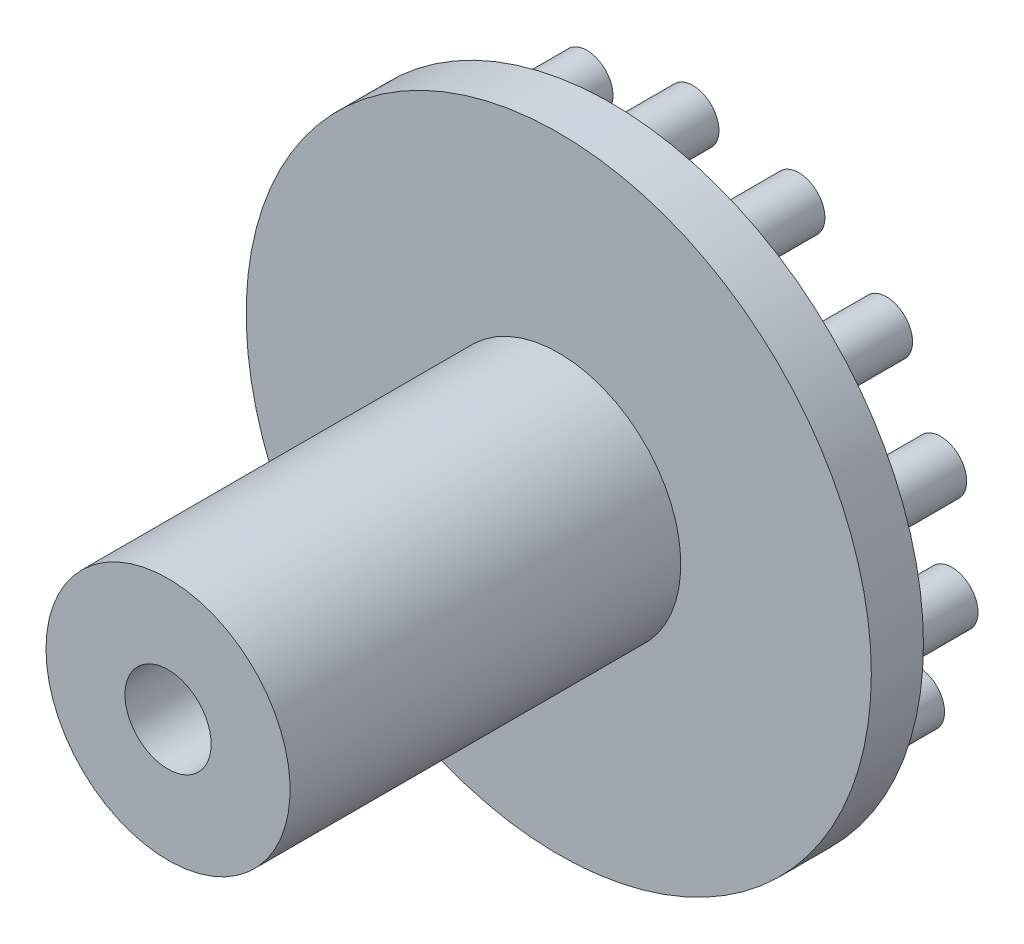
ISO-10303-21;
HEADER;
FILE_DESCRIPTION(('STEP AP214'),'2;1');
FILE_NAME('part.step','',(''),(''),'','','');
FILE_SCHEMA(('AUTOMOTIVE_DESIGN { 1 0 10303 214 1 1 1 1 }'));
ENDSEC;
DATA;
#1=APPLICATION_CONTEXT('core data for automotive mechanical design processes');
#2=APPLICATION_PROTOCOL_DEFINITION('international standard','automotive_design',2000,#1);
#3=PRODUCT_CONTEXT('',#1,'mechanical');
#4=PRODUCT('Part','Part','',(#3));
#5=PRODUCT_RELATED_PRODUCT_CATEGORY('part','',(#4));
#6=PRODUCT_DEFINITION_FORMATION('','',#4);
#7=PRODUCT_DEFINITION_CONTEXT('part definition',#1,'design');
#8=PRODUCT_DEFINITION('design','',#6,#7);
#9=PRODUCT_DEFINITION_SHAPE('','',#8);
#10=(LENGTH_UNIT() NAMED_UNIT(*) SI_UNIT(.MILLI.,.METRE.));
#11=(NAMED_UNIT(*) PLANE_ANGLE_UNIT() SI_UNIT($,.RADIAN.));
#12=(NAMED_UNIT(*) SI_UNIT($,.STERADIAN.) SOLID_ANGLE_UNIT());
#13=UNCERTAINTY_MEASURE_WITH_UNIT(LENGTH_MEASURE(1.E-05),#10,'distance_accuracy_value','');
#14=(GEOMETRIC_REPRESENTATION_CONTEXT(3) GLOBAL_UNCERTAINTY_ASSIGNED_CONTEXT((#13)) GLOBAL_UNIT_ASSIGNED_CONTEXT((#10,
#11,#12)) REPRESENTATION_CONTEXT('',''));
#15=CARTESIAN_POINT('',(0.,0.,0.));
#16=DIRECTION('',(0.,0.,1.));
#17=DIRECTION('',(1.,0.,0.));
#18=AXIS2_PLACEMENT_3D('',#15,#16,#17);
#19=CARTESIAN_POINT('',(0.,0.,2.54));
#20=DIRECTION('',(0.,0.,1.));
#21=DIRECTION('',(1.,0.,0.));
#22=AXIS2_PLACEMENT_3D('',#19,#20,#21);
#23=PLANE('',#22);
#24=CARTESIAN_POINT('',(0.,0.,2.54));
#25=DIRECTION('',(0.,0.,1.));
#26=DIRECTION('',(1.,0.,0.));
#27=AXIS2_PLACEMENT_3D('',#24,#25,#26);
#28=CIRCLE('',#27,5.95);
#29=CARTESIAN_POINT('',(-5.95,0.,2.54));
#30=VERTEX_POINT('',#29);
#31=EDGE_CURVE('E132',#30,#30,#28,.T.);
#32=ORIENTED_EDGE('',*,*,#31,.F.);
#33=EDGE_LOOP('',(#32));
#34=FACE_BOUND('',#33,.T.);
#35=CARTESIAN_POINT('',(0.,0.,2.54));
#36=DIRECTION('',(0.,0.,1.));
#37=DIRECTION('',(1.,0.,0.));
#38=AXIS2_PLACEMENT_3D('',#35,#36,#37);
#39=CIRCLE('',#38,15.24);
#40=CARTESIAN_POINT('',(15.24,0.,2.54));
#41=VERTEX_POINT('',#40);
#42=EDGE_CURVE('E115',#41,#41,#39,.T.);
#43=ORIENTED_EDGE('',*,*,#42,.T.);
#44=EDGE_LOOP('',(#43));
#45=FACE_BOUND('',#44,.T.);
#46=ADVANCED_FACE('F47',(#34,#45),#23,.T.);
#47=CARTESIAN_POINT('',(0.,0.,0.));
#48=DIRECTION('',(0.,0.,1.));
#49=DIRECTION('',(1.,0.,0.));
#50=AXIS2_PLACEMENT_3D('',#47,#48,#49);
#51=PLANE('',#50);
#52=CARTESIAN_POINT('',(5.1655553670626,11.6020273120607,0.));
#53=DIRECTION('',(0.,0.,1.));
#54=DIRECTION('',(1.,0.,0.));
#55=AXIS2_PLACEMENT_3D('',#52,#53,#54);
#56=CIRCLE('',#55,1.27);
#57=CARTESIAN_POINT('',(6.4355553670626,11.6020273120607,0.));
#58=VERTEX_POINT('',#57);
#59=EDGE_CURVE('E10',#58,#58,#56,.F.);
#60=ORIENTED_EDGE('',*,*,#59,.F.);
#61=EDGE_LOOP('',(#60));
#62=FACE_BOUND('',#61,.T.);
#63=CARTESIAN_POINT('',(9.43793928356291,8.4979587007575,0.));
#64=DIRECTION('',(0.,0.,1.));
#65=DIRECTION('',(1.,0.,0.));
#66=AXIS2_PLACEMENT_3D('',#63,#64,#65);
#67=CIRCLE('',#66,1.27);
#68=CARTESIAN_POINT('',(10.7079392835629,8.4979587007575,0.));
#69=VERTEX_POINT('',#68);
#70=EDGE_CURVE('E55',#69,#69,#67,.F.);
#71=ORIENTED_EDGE('',*,*,#70,.F.);
#72=EDGE_LOOP('',(#71));
#73=FACE_BOUND('',#72,.T.);
#74=CARTESIAN_POINT('',(12.0784177569485,3.92451582856183,0.));
#75=DIRECTION('',(0.,0.,1.));
#76=DIRECTION('',(1.,0.,0.));
#77=AXIS2_PLACEMENT_3D('',#74,#75,#76);
#78=CIRCLE('',#77,1.27);
#79=CARTESIAN_POINT('',(13.3484177569485,3.92451582856183,0.));
#80=VERTEX_POINT('',#79);
#81=EDGE_CURVE('E60',#80,#80,#78,.F.);
#82=ORIENTED_EDGE('',*,*,#81,.F.);
#83=EDGE_LOOP('',(#82));
#84=FACE_BOUND('',#83,.T.);
#85=CARTESIAN_POINT('',(12.6304280711771,-1.32751148349921,0.));
#86=DIRECTION('',(0.,0.,1.));
#87=DIRECTION('',(1.,0.,0.));
#88=AXIS2_PLACEMENT_3D('',#85,#86,#87);
#89=CIRCLE('',#88,1.27);
#90=CARTESIAN_POINT('',(13.9004280711771,-1.32751148349921,0.));
#91=VERTEX_POINT('',#90);
#92=EDGE_CURVE('E65',#91,#91,#89,.F.);
#93=ORIENTED_EDGE('',*,*,#92,.F.);
#94=EDGE_LOOP('',(#93));
#95=FACE_BOUND('',#94,.T.);
#96=CARTESIAN_POINT('',(10.9985226280624,-6.35000000000001,0.));
#97=DIRECTION('',(0.,0.,1.));
#98=DIRECTION('',(1.,0.,0.));
#99=AXIS2_PLACEMENT_3D('',#96,#97,#98);
#100=CIRCLE('',#99,1.27);
#101=CARTESIAN_POINT('',(12.2685226280624,-6.35000000000001,0.));
#102=VERTEX_POINT('',#101);
#103=EDGE_CURVE('E71',#102,#102,#100,.F.);
#104=ORIENTED_EDGE('',*,*,#103,.F.);
#105=EDGE_LOOP('',(#104));
#106=FACE_BOUND('',#105,.T.);
#107=CARTESIAN_POINT('',(7.46487270411441,-10.2745158285618,0.));
#108=DIRECTION('',(0.,0.,1.));
#109=DIRECTION('',(1.,0.,0.));
#110=AXIS2_PLACEMENT_3D('',#107,#108,#109);
#111=CIRCLE('',#110,1.27);
#112=CARTESIAN_POINT('',(8.73487270411441,-10.2745158285618,0.));
#113=VERTEX_POINT('',#112);
#114=EDGE_CURVE('E75',#113,#113,#111,.F.);
#115=ORIENTED_EDGE('',*,*,#114,.F.);
#116=EDGE_LOOP('',(#115));
#117=FACE_BOUND('',#116,.T.);
#118=CARTESIAN_POINT('',(2.64047847338554,-12.4224745293193,0.));
#119=DIRECTION('',(0.,0.,1.));
#120=DIRECTION('',(1.,0.,0.));
#121=AXIS2_PLACEMENT_3D('',#118,#119,#120);
#122=CIRCLE('',#121,1.27);
#123=CARTESIAN_POINT('',(3.91047847338554,-12.4224745293193,0.));
#124=VERTEX_POINT('',#123);
#125=EDGE_CURVE('E79',#124,#124,#122,.F.);
#126=ORIENTED_EDGE('',*,*,#125,.F.);
#127=EDGE_LOOP('',(#126));
#128=FACE_BOUND('',#127,.T.);
#129=CARTESIAN_POINT('',(-2.64047847338555,-12.4224745293193,0.));
#130=DIRECTION('',(0.,0.,1.));
#131=DIRECTION('',(1.,0.,0.));
#132=AXIS2_PLACEMENT_3D('',#129,#130,#131);
#133=CIRCLE('',#132,1.27);
#134=CARTESIAN_POINT('',(-1.37047847338555,-12.4224745293193,0.));
#135=VERTEX_POINT('',#134);
#136=EDGE_CURVE('E83',#135,#135,#133,.F.);
#137=ORIENTED_EDGE('',*,*,#136,.F.);
#138=EDGE_LOOP('',(#137));
#139=FACE_BOUND('',#138,.T.);
#140=CARTESIAN_POINT('',(-7.46487270411441,-10.2745158285618,0.));
#141=DIRECTION('',(0.,0.,1.));
#142=DIRECTION('',(1.,0.,0.));
#143=AXIS2_PLACEMENT_3D('',#140,#141,#142);
#144=CIRCLE('',#143,1.27);
#145=CARTESIAN_POINT('',(-6.19487270411441,-10.2745158285618,0.));
#146=VERTEX_POINT('',#145);
#147=EDGE_CURVE('E87',#146,#146,#144,.F.);
#148=ORIENTED_EDGE('',*,*,#147,.F.);
#149=EDGE_LOOP('',(#148));
#150=FACE_BOUND('',#149,.T.);
#151=CARTESIAN_POINT('',(-10.9985226280624,-6.35,0.));
#152=DIRECTION('',(0.,0.,1.));
#153=DIRECTION('',(1.,0.,0.));
#154=AXIS2_PLACEMENT_3D('',#151,#152,#153);
#155=CIRCLE('',#154,1.27);
#156=CARTESIAN_POINT('',(-9.72852262806237,-6.35,0.));
#157=VERTEX_POINT('',#156);
#158=EDGE_CURVE('E91',#157,#157,#155,.F.);
#159=ORIENTED_EDGE('',*,*,#158,.F.);
#160=EDGE_LOOP('',(#159));
#161=FACE_BOUND('',#160,.T.);
#162=CARTESIAN_POINT('',(-12.6304280711771,-1.3275114834992,0.));
#163=DIRECTION('',(0.,0.,1.));
#164=DIRECTION('',(1.,0.,0.));
#165=AXIS2_PLACEMENT_3D('',#162,#163,#164);
#166=CIRCLE('',#165,1.27);
#167=CARTESIAN_POINT('',(-11.3604280711771,-1.3275114834992,0.));
#168=VERTEX_POINT('',#167);
#169=EDGE_CURVE('E95',#168,#168,#166,.F.);
#170=ORIENTED_EDGE('',*,*,#169,.F.);
#171=EDGE_LOOP('',(#170));
#172=FACE_BOUND('',#171,.T.);
#173=CARTESIAN_POINT('',(-12.0784177569485,3.92451582856183,0.));
#174=DIRECTION('',(0.,0.,1.));
#175=DIRECTION('',(1.,0.,0.));
#176=AXIS2_PLACEMENT_3D('',#173,#174,#175);
#177=CIRCLE('',#176,1.27);
#178=CARTESIAN_POINT('',(-10.8084177569485,3.92451582856183,0.));
#179=VERTEX_POINT('',#178);
#180=EDGE_CURVE('E99',#179,#179,#177,.F.);
#181=ORIENTED_EDGE('',*,*,#180,.F.);
#182=EDGE_LOOP('',(#181));
#183=FACE_BOUND('',#182,.T.);
#184=CARTESIAN_POINT('',(-9.43793928356291,8.4979587007575,0.));
#185=DIRECTION('',(0.,0.,1.));
#186=DIRECTION('',(1.,0.,0.));
#187=AXIS2_PLACEMENT_3D('',#184,#185,#186);
#188=CIRCLE('',#187,1.27);
#189=CARTESIAN_POINT('',(-8.16793928356291,8.4979587007575,0.));
#190=VERTEX_POINT('',#189);
#191=EDGE_CURVE('E103',#190,#190,#188,.F.);
#192=ORIENTED_EDGE('',*,*,#191,.F.);
#193=EDGE_LOOP('',(#192));
#194=FACE_BOUND('',#193,.T.);
#195=CARTESIAN_POINT('',(-5.16555536706272,11.6020273120613,0.));
#196=DIRECTION('',(0.,0.,1.));
#197=DIRECTION('',(1.,0.,0.));
#198=AXIS2_PLACEMENT_3D('',#195,#196,#197);
#199=CIRCLE('',#198,1.27);
#200=CARTESIAN_POINT('',(-3.89555536706272,11.6020273120613,0.));
#201=VERTEX_POINT('',#200);
#202=EDGE_CURVE('E107',#201,#201,#199,.F.);
#203=ORIENTED_EDGE('',*,*,#202,.F.);
#204=EDGE_LOOP('',(#203));
#205=FACE_BOUND('',#204,.T.);
#206=CARTESIAN_POINT('',(0.,12.7,0.));
#207=DIRECTION('',(0.,0.,1.));
#208=DIRECTION('',(1.,0.,0.));
#209=AXIS2_PLACEMENT_3D('',#206,#207,#208);
#210=CIRCLE('',#209,1.27);
#211=CARTESIAN_POINT('',(1.27,12.7,0.));
#212=VERTEX_POINT('',#211);
#213=EDGE_CURVE('E111',#212,#212,#210,.F.);
#214=ORIENTED_EDGE('',*,*,#213,.F.);
#215=EDGE_LOOP('',(#214));
#216=FACE_BOUND('',#215,.T.);
#217=CARTESIAN_POINT('',(0.,0.,0.));
#218=DIRECTION('',(0.,0.,1.));
#219=DIRECTION('',(1.,0.,0.));
#220=AXIS2_PLACEMENT_3D('',#217,#218,#219);
#221=CIRCLE('',#220,15.24);
#222=CARTESIAN_POINT('',(15.24,0.,0.));
#223=VERTEX_POINT('',#222);
#224=EDGE_CURVE('E116',#223,#223,#221,.T.);
#225=ORIENTED_EDGE('',*,*,#224,.F.);
#226=EDGE_LOOP('',(#225));
#227=FACE_BOUND('',#226,.T.);
#228=CARTESIAN_POINT('',(0.,0.,0.));
#229=DIRECTION('',(0.,0.,1.));
#230=DIRECTION('',(1.,0.,0.));
#231=AXIS2_PLACEMENT_3D('',#228,#229,#230);
#232=CIRCLE('',#231,4.55);
#233=CARTESIAN_POINT('',(4.55,0.,0.));
#234=VERTEX_POINT('',#233);
#235=EDGE_CURVE('E120',#234,#234,#232,.T.);
#236=ORIENTED_EDGE('',*,*,#235,.T.);
#237=EDGE_LOOP('',(#236));
#238=FACE_BOUND('',#237,.T.);
#239=ADVANCED_FACE('F227',(#62,#73,#84,#95,#106,#117,#128,#139,#150,#161,#172,#183,#194,#205,
#216,#227,#238),#51,.F.);
#240=CARTESIAN_POINT('',(0.,0.,2.54));
#241=DIRECTION('',(0.,0.,-1.));
#242=DIRECTION('',(-1.,0.,0.));
#243=AXIS2_PLACEMENT_3D('',#240,#241,#242);
#244=CYLINDRICAL_SURFACE('',#243,15.24);
#245=ORIENTED_EDGE('',*,*,#42,.F.);
#246=EDGE_LOOP('',(#245));
#247=FACE_BOUND('',#246,.T.);
#248=ORIENTED_EDGE('',*,*,#224,.T.);
#249=EDGE_LOOP('',(#248));
#250=FACE_BOUND('',#249,.T.);
#251=ADVANCED_FACE('F49',(#247,#250),#244,.T.);
#252=CARTESIAN_POINT('',(0.,0.,2.54));
#253=DIRECTION('',(0.,0.,-1.));
#254=DIRECTION('',(-1.,0.,0.));
#255=AXIS2_PLACEMENT_3D('',#252,#253,#254);
#256=CYLINDRICAL_SURFACE('',#255,4.55);
#257=CARTESIAN_POINT('',(0.,0.,2.54));
#258=DIRECTION('',(0.,0.,1.));
#259=DIRECTION('',(1.,0.,0.));
#260=AXIS2_PLACEMENT_3D('',#257,#258,#259);
#261=CIRCLE('',#260,4.55);
#262=CARTESIAN_POINT('',(4.55,0.,2.54));
#263=VERTEX_POINT('',#262);
#264=EDGE_CURVE('E127',#263,#263,#261,.T.);
#265=ORIENTED_EDGE('',*,*,#264,.T.);
#266=EDGE_LOOP('',(#265));
#267=FACE_BOUND('',#266,.T.);
#268=ORIENTED_EDGE('',*,*,#235,.F.);
#269=EDGE_LOOP('',(#268));
#270=FACE_BOUND('',#269,.T.);
#271=ADVANCED_FACE('F233',(#267,#270),#256,.F.);
#272=CARTESIAN_POINT('',(0.,0.,2.54));
#273=DIRECTION('',(0.,0.,1.));
#274=DIRECTION('',(1.,0.,0.));
#275=AXIS2_PLACEMENT_3D('',#272,#273,#274);
#276=PLANE('',#275);
#277=CARTESIAN_POINT('',(0.,0.,2.54));
#278=DIRECTION('',(0.,0.,1.));
#279=DIRECTION('',(1.,0.,0.));
#280=AXIS2_PLACEMENT_3D('',#277,#278,#279);
#281=CIRCLE('',#280,2.1);
#282=CARTESIAN_POINT('',(2.1,0.,2.54));
#283=VERTEX_POINT('',#282);
#284=EDGE_CURVE('E199',#283,#283,#281,.T.);
#285=ORIENTED_EDGE('',*,*,#284,.T.);
#286=EDGE_LOOP('',(#285));
#287=FACE_BOUND('',#286,.T.);
#288=ORIENTED_EDGE('',*,*,#264,.F.);
#289=EDGE_LOOP('',(#288));
#290=FACE_BOUND('',#289,.T.);
#291=ADVANCED_FACE('F221',(#287,#290),#276,.F.);
#292=CARTESIAN_POINT('',(0.,0.,21.59));
#293=DIRECTION('',(0.,0.,-1.));
#294=DIRECTION('',(-1.,0.,0.));
#295=AXIS2_PLACEMENT_3D('',#292,#293,#294);
#296=CYLINDRICAL_SURFACE('',#295,5.95);
#297=CARTESIAN_POINT('',(0.,0.,21.59));
#298=DIRECTION('',(0.,0.,1.));
#299=DIRECTION('',(1.,0.,0.));
#300=AXIS2_PLACEMENT_3D('',#297,#298,#299);
#301=CIRCLE('',#300,5.95);
#302=CARTESIAN_POINT('',(-5.95,0.,21.59));
#303=VERTEX_POINT('',#302);
#304=EDGE_CURVE('E131',#303,#303,#301,.T.);
#305=CARTESIAN_POINT('',(-5.95,0.,21.59));
#306=CARTESIAN_POINT('',(-5.95,0.,21.3915625));
#307=CARTESIAN_POINT('',(-5.95,0.,21.193125));
#308=CARTESIAN_POINT('',(-5.95,0.,20.79625));
#309=CARTESIAN_POINT('',(-5.95,0.,20.5978125));
#310=CARTESIAN_POINT('',(-5.95,0.,20.2009375));
#311=CARTESIAN_POINT('',(-5.95,0.,20.0025));
#312=CARTESIAN_POINT('',(-5.95,0.,19.605625));
#313=CARTESIAN_POINT('',(-5.95,0.,19.4071875));
#314=CARTESIAN_POINT('',(-5.95,0.,19.0103125));
#315=CARTESIAN_POINT('',(-5.95,0.,18.811875));
#316=CARTESIAN_POINT('',(-5.95,0.,18.415));
#317=CARTESIAN_POINT('',(-5.95,0.,18.2165625));
#318=CARTESIAN_POINT('',(-5.95,0.,17.8196875));
#319=CARTESIAN_POINT('',(-5.95,0.,17.62125));
#320=CARTESIAN_POINT('',(-5.95,0.,17.224375));
#321=CARTESIAN_POINT('',(-5.95,0.,17.0259375));
#322=CARTESIAN_POINT('',(-5.95,0.,16.6290625));
#323=CARTESIAN_POINT('',(-5.95,0.,16.430625));
#324=CARTESIAN_POINT('',(-5.95,0.,16.03375));
#325=CARTESIAN_POINT('',(-5.95,0.,15.8353125));
#326=CARTESIAN_POINT('',(-5.95,0.,15.4384375));
#327=CARTESIAN_POINT('',(-5.95,0.,15.24));
#328=CARTESIAN_POINT('',(-5.95,0.,14.843125));
#329=CARTESIAN_POINT('',(-5.95,0.,14.6446875));
#330=CARTESIAN_POINT('',(-5.95,0.,14.2478125));
#331=CARTESIAN_POINT('',(-5.95,0.,14.049375));
#332=CARTESIAN_POINT('',(-5.95,0.,13.6525));
#333=CARTESIAN_POINT('',(-5.95,0.,13.4540625));
#334=CARTESIAN_POINT('',(-5.95,0.,13.0571875));
#335=CARTESIAN_POINT('',(-5.95,0.,12.85875));
#336=CARTESIAN_POINT('',(-5.95,0.,12.461875));
#337=CARTESIAN_POINT('',(-5.95,0.,12.2634375));
#338=CARTESIAN_POINT('',(-5.95,0.,11.8665625));
#339=CARTESIAN_POINT('',(-5.95,0.,11.668125));
#340=CARTESIAN_POINT('',(-5.95,0.,11.27125));
#341=CARTESIAN_POINT('',(-5.95,0.,11.0728125));
#342=CARTESIAN_POINT('',(-5.95,0.,10.6759375));
#343=CARTESIAN_POINT('',(-5.95,0.,10.4775));
#344=CARTESIAN_POINT('',(-5.95,0.,10.080625));
#345=CARTESIAN_POINT('',(-5.95,0.,9.8821875));
#346=CARTESIAN_POINT('',(-5.95,0.,9.4853125));
#347=CARTESIAN_POINT('',(-5.95,0.,9.286875));
#348=CARTESIAN_POINT('',(-5.95,0.,8.89));
#349=CARTESIAN_POINT('',(-5.95,0.,8.6915625));
#350=CARTESIAN_POINT('',(-5.95,0.,8.2946875));
#351=CARTESIAN_POINT('',(-5.95,0.,8.09625));
#352=CARTESIAN_POINT('',(-5.95,0.,7.699375));
#353=CARTESIAN_POINT('',(-5.95,0.,7.5009375));
#354=CARTESIAN_POINT('',(-5.95,0.,7.1040625));
#355=CARTESIAN_POINT('',(-5.95,0.,6.905625));
#356=CARTESIAN_POINT('',(-5.95,0.,6.50875));
#357=CARTESIAN_POINT('',(-5.95,0.,6.3103125));
#358=CARTESIAN_POINT('',(-5.95,0.,5.9134375));
#359=CARTESIAN_POINT('',(-5.95,0.,5.715));
#360=CARTESIAN_POINT('',(-5.95,0.,5.318125));
#361=CARTESIAN_POINT('',(-5.95,0.,5.1196875));
#362=CARTESIAN_POINT('',(-5.95,0.,4.7228125));
#363=CARTESIAN_POINT('',(-5.95,0.,4.524375));
#364=CARTESIAN_POINT('',(-5.95,0.,4.1275));
#365=CARTESIAN_POINT('',(-5.95,0.,3.9290625));
#366=CARTESIAN_POINT('',(-5.95,0.,3.5321875));
#367=CARTESIAN_POINT('',(-5.95,0.,3.33375));
#368=CARTESIAN_POINT('',(-5.95,0.,2.936875));
#369=CARTESIAN_POINT('',(-5.95,0.,2.7384375));
#370=CARTESIAN_POINT('',(-5.95,0.,2.54));
#371=B_SPLINE_CURVE_WITH_KNOTS('',3,(#305,#306,#307,#308,#309,#310,#311,#312,#313,#314,#315,
#316,#317,#318,#319,#320,#321,#322,#323,#324,#325,#326,#327,#328,#329,#330,#331,#332,#333,#334,
#335,#336,#337,#338,#339,#340,#341,#342,#343,#344,#345,#346,#347,#348,#349,#350,#351,#352,#353,
#354,#355,#356,#357,#358,#359,#360,#361,#362,#363,#364,#365,#366,#367,#368,#369,#370),
.UNSPECIFIED.,.F.,.F.,(4,2,2,2,2,2,2,2,2,2,2,2,2,2,2,2,2,2,2,2,2,2,2,2,2,2,2,2,2,2,2,2,4),(0.,
0.595312499999997,1.190625,1.7859375,2.38125,2.9765625,3.571875,4.1671875,4.7625,5.3578125,
5.953125,6.5484375,7.14375,7.7390625,8.334375,8.9296875,9.525,10.1203125,10.715625,11.3109375,
11.90625,12.5015625,13.096875,13.6921875,14.2875,14.8828125,15.478125,16.0734375,16.66875,
17.2640625,17.859375,18.4546875,19.05),.UNSPECIFIED.);
#372=EDGE_CURVE('BSEAM215',#303,#30,#371,.T.);
#373=ORIENTED_EDGE('',*,*,#304,.F.);
#374=ORIENTED_EDGE('',*,*,#31,.T.);
#375=ORIENTED_EDGE('',*,*,#372,.T.);
#376=ORIENTED_EDGE('',*,*,#372,.F.);
#377=EDGE_LOOP('',(#373,#375,#374,#376));
#378=FACE_BOUND('',#377,.T.);
#379=ADVANCED_FACE('F215',(#378),#296,.T.);
#380=CARTESIAN_POINT('',(0.,0.,21.59));
#381=DIRECTION('',(0.,0.,1.));
#382=DIRECTION('',(1.,0.,0.));
#383=AXIS2_PLACEMENT_3D('',#380,#381,#382);
#384=PLANE('',#383);
#385=CARTESIAN_POINT('',(0.,0.,21.59));
#386=DIRECTION('',(0.,0.,1.));
#387=DIRECTION('',(1.,0.,0.));
#388=AXIS2_PLACEMENT_3D('',#385,#386,#387);
#389=CIRCLE('',#388,2.1);
#390=CARTESIAN_POINT('',(2.1,0.,21.59));
#391=VERTEX_POINT('',#390);
#392=EDGE_CURVE('E203',#391,#391,#389,.T.);
#393=ORIENTED_EDGE('',*,*,#392,.F.);
#394=EDGE_LOOP('',(#393));
#395=FACE_BOUND('',#394,.T.);
#396=ORIENTED_EDGE('',*,*,#304,.T.);
#397=EDGE_LOOP('',(#396));
#398=FACE_BOUND('',#397,.T.);
#399=ADVANCED_FACE('F211',(#395,#398),#384,.T.);
#400=CARTESIAN_POINT('',(0.,12.7,-4.000000128));
#401=DIRECTION('',(0.,0.,1.));
#402=DIRECTION('',(1.,0.,0.));
#403=AXIS2_PLACEMENT_3D('',#400,#401,#402);
#404=CYLINDRICAL_SURFACE('',#403,1.27);
#405=CARTESIAN_POINT('',(0.,12.7,-4.000000128));
#406=DIRECTION('',(0.,0.,-1.));
#407=DIRECTION('',(-1.,0.,0.));
#408=AXIS2_PLACEMENT_3D('',#405,#406,#407);
#409=CIRCLE('',#408,1.27);
#410=CARTESIAN_POINT('',(-1.27,12.7,-4.000000128));
#411=VERTEX_POINT('',#410);
#412=EDGE_CURVE('E136',#411,#411,#409,.T.);
#413=ORIENTED_EDGE('',*,*,#412,.F.);
#414=EDGE_LOOP('',(#413));
#415=FACE_BOUND('',#414,.T.);
#416=ORIENTED_EDGE('',*,*,#213,.T.);
#417=EDGE_LOOP('',(#416));
#418=FACE_BOUND('',#417,.T.);
#419=ADVANCED_FACE('F214',(#415,#418),#404,.T.);
#420=CARTESIAN_POINT('',(0.,12.7,-4.000000128));
#421=DIRECTION('',(0.,0.,-1.));
#422=DIRECTION('',(-1.,0.,0.));
#423=AXIS2_PLACEMENT_3D('',#420,#421,#422);
#424=PLANE('',#423);
#425=ORIENTED_EDGE('',*,*,#412,.T.);
#426=EDGE_LOOP('',(#425));
#427=FACE_BOUND('',#426,.T.);
#428=ADVANCED_FACE('F252',(#427),#424,.T.);
#429=CARTESIAN_POINT('',(-5.16555536706272,11.6020273120613,-4.000000128));
#430=DIRECTION('',(0.,0.,1.));
#431=DIRECTION('',(1.,0.,0.));
#432=AXIS2_PLACEMENT_3D('',#429,#430,#431);
#433=CYLINDRICAL_SURFACE('',#432,1.27);
#434=CARTESIAN_POINT('',(-5.16555536706272,11.6020273120613,-4.000000128));
#435=DIRECTION('',(0.,0.,-1.));
#436=DIRECTION('',(-1.,0.,0.));
#437=AXIS2_PLACEMENT_3D('',#434,#435,#436);
#438=CIRCLE('',#437,1.27);
#439=CARTESIAN_POINT('',(-6.43555536706273,11.6020273120613,-4.000000128));
#440=VERTEX_POINT('',#439);
#441=EDGE_CURVE('E143',#440,#440,#438,.T.);
#442=ORIENTED_EDGE('',*,*,#441,.F.);
#443=EDGE_LOOP('',(#442));
#444=FACE_BOUND('',#443,.T.);
#445=ORIENTED_EDGE('',*,*,#202,.T.);
#446=EDGE_LOOP('',(#445));
#447=FACE_BOUND('',#446,.T.);
#448=ADVANCED_FACE('F256',(#444,#447),#433,.T.);
#449=CARTESIAN_POINT('',(-5.16555536706272,11.6020273120613,-4.000000128));
#450=DIRECTION('',(0.,0.,-1.));
#451=DIRECTION('',(-1.,0.,0.));
#452=AXIS2_PLACEMENT_3D('',#449,#450,#451);
#453=PLANE('',#452);
#454=ORIENTED_EDGE('',*,*,#441,.T.);
#455=EDGE_LOOP('',(#454));
#456=FACE_BOUND('',#455,.T.);
#457=ADVANCED_FACE('F258',(#456),#453,.T.);
#458=CARTESIAN_POINT('',(-9.43793928356291,8.4979587007575,-4.000000128));
#459=DIRECTION('',(0.,0.,1.));
#460=DIRECTION('',(1.,0.,0.));
#461=AXIS2_PLACEMENT_3D('',#458,#459,#460);
#462=CYLINDRICAL_SURFACE('',#461,1.27);
#463=CARTESIAN_POINT('',(-9.43793928356291,8.4979587007575,-4.000000128));
#464=DIRECTION('',(0.,0.,-1.));
#465=DIRECTION('',(-1.,0.,0.));
#466=AXIS2_PLACEMENT_3D('',#463,#464,#465);
#467=CIRCLE('',#466,1.27);
#468=CARTESIAN_POINT('',(-10.7079392835629,8.4979587007575,-4.000000128));
#469=VERTEX_POINT('',#468);
#470=EDGE_CURVE('E147',#469,#469,#467,.T.);
#471=ORIENTED_EDGE('',*,*,#470,.F.);
#472=EDGE_LOOP('',(#471));
#473=FACE_BOUND('',#472,.T.);
#474=ORIENTED_EDGE('',*,*,#191,.T.);
#475=EDGE_LOOP('',(#474));
#476=FACE_BOUND('',#475,.T.);
#477=ADVANCED_FACE('F261',(#473,#476),#462,.T.);
#478=CARTESIAN_POINT('',(-9.43793928356291,8.4979587007575,-4.000000128));
#479=DIRECTION('',(0.,0.,-1.));
#480=DIRECTION('',(-1.,0.,0.));
#481=AXIS2_PLACEMENT_3D('',#478,#479,#480);
#482=PLANE('',#481);
#483=ORIENTED_EDGE('',*,*,#470,.T.);
#484=EDGE_LOOP('',(#483));
#485=FACE_BOUND('',#484,.T.);
#486=ADVANCED_FACE('F266',(#485),#482,.T.);
#487=CARTESIAN_POINT('',(-12.0784177569485,3.92451582856183,-4.000000128));
#488=DIRECTION('',(0.,0.,1.));
#489=DIRECTION('',(1.,0.,0.));
#490=AXIS2_PLACEMENT_3D('',#487,#488,#489);
#491=CYLINDRICAL_SURFACE('',#490,1.27);
#492=CARTESIAN_POINT('',(-12.0784177569485,3.92451582856183,-4.000000128));
#493=DIRECTION('',(0.,0.,-1.));
#494=DIRECTION('',(-1.,0.,0.));
#495=AXIS2_PLACEMENT_3D('',#492,#493,#494);
#496=CIRCLE('',#495,1.27);
#497=CARTESIAN_POINT('',(-13.3484177569485,3.92451582856183,-4.000000128));
#498=VERTEX_POINT('',#497);
#499=EDGE_CURVE('E151',#498,#498,#496,.T.);
#500=ORIENTED_EDGE('',*,*,#499,.F.);
#501=EDGE_LOOP('',(#500));
#502=FACE_BOUND('',#501,.T.);
#503=ORIENTED_EDGE('',*,*,#180,.T.);
#504=EDGE_LOOP('',(#503));
#505=FACE_BOUND('',#504,.T.);
#506=ADVANCED_FACE('F269',(#502,#505),#491,.T.);
#507=CARTESIAN_POINT('',(-12.0784177569485,3.92451582856183,-4.000000128));
#508=DIRECTION('',(0.,0.,-1.));
#509=DIRECTION('',(-1.,0.,0.));
#510=AXIS2_PLACEMENT_3D('',#507,#508,#509);
#511=PLANE('',#510);
#512=ORIENTED_EDGE('',*,*,#499,.T.);
#513=EDGE_LOOP('',(#512));
#514=FACE_BOUND('',#513,.T.);
#515=ADVANCED_FACE('F274',(#514),#511,.T.);
#516=CARTESIAN_POINT('',(-12.6304280711771,-1.3275114834992,-4.000000128));
#517=DIRECTION('',(0.,0.,1.));
#518=DIRECTION('',(1.,0.,0.));
#519=AXIS2_PLACEMENT_3D('',#516,#517,#518);
#520=CYLINDRICAL_SURFACE('',#519,1.27);
#521=CARTESIAN_POINT('',(-12.6304280711771,-1.3275114834992,-4.000000128));
#522=DIRECTION('',(0.,0.,-1.));
#523=DIRECTION('',(-1.,0.,0.));
#524=AXIS2_PLACEMENT_3D('',#521,#522,#523);
#525=CIRCLE('',#524,1.27);
#526=CARTESIAN_POINT('',(-13.9004280711771,-1.3275114834992,-4.000000128));
#527=VERTEX_POINT('',#526);
#528=EDGE_CURVE('E155',#527,#527,#525,.T.);
#529=ORIENTED_EDGE('',*,*,#528,.F.);
#530=EDGE_LOOP('',(#529));
#531=FACE_BOUND('',#530,.T.);
#532=ORIENTED_EDGE('',*,*,#169,.T.);
#533=EDGE_LOOP('',(#532));
#534=FACE_BOUND('',#533,.T.);
#535=ADVANCED_FACE('F277',(#531,#534),#520,.T.);
#536=CARTESIAN_POINT('',(-12.6304280711771,-1.3275114834992,-4.000000128));
#537=DIRECTION('',(0.,0.,-1.));
#538=DIRECTION('',(-1.,0.,0.));
#539=AXIS2_PLACEMENT_3D('',#536,#537,#538);
#540=PLANE('',#539);
#541=ORIENTED_EDGE('',*,*,#528,.T.);
#542=EDGE_LOOP('',(#541));
#543=FACE_BOUND('',#542,.T.);
#544=ADVANCED_FACE('F282',(#543),#540,.T.);
#545=CARTESIAN_POINT('',(-10.9985226280624,-6.35,-4.000000128));
#546=DIRECTION('',(0.,0.,1.));
#547=DIRECTION('',(1.,0.,0.));
#548=AXIS2_PLACEMENT_3D('',#545,#546,#547);
#549=CYLINDRICAL_SURFACE('',#548,1.27);
#550=CARTESIAN_POINT('',(-10.9985226280624,-6.35,-4.000000128));
#551=DIRECTION('',(0.,0.,-1.));
#552=DIRECTION('',(-1.,0.,0.));
#553=AXIS2_PLACEMENT_3D('',#550,#551,#552);
#554=CIRCLE('',#553,1.27);
#555=CARTESIAN_POINT('',(-12.2685226280624,-6.35,-4.000000128));
#556=VERTEX_POINT('',#555);
#557=EDGE_CURVE('E159',#556,#556,#554,.T.);
#558=ORIENTED_EDGE('',*,*,#557,.F.);
#559=EDGE_LOOP('',(#558));
#560=FACE_BOUND('',#559,.T.);
#561=ORIENTED_EDGE('',*,*,#158,.T.);
#562=EDGE_LOOP('',(#561));
#563=FACE_BOUND('',#562,.T.);
#564=ADVANCED_FACE('F285',(#560,#563),#549,.T.);
#565=CARTESIAN_POINT('',(-10.9985226280624,-6.35,-4.000000128));
#566=DIRECTION('',(0.,0.,-1.));
#567=DIRECTION('',(-1.,0.,0.));
#568=AXIS2_PLACEMENT_3D('',#565,#566,#567);
#569=PLANE('',#568);
#570=ORIENTED_EDGE('',*,*,#557,.T.);
#571=EDGE_LOOP('',(#570));
#572=FACE_BOUND('',#571,.T.);
#573=ADVANCED_FACE('F290',(#572),#569,.T.);
#574=CARTESIAN_POINT('',(-7.46487270411441,-10.2745158285618,-4.000000128));
#575=DIRECTION('',(0.,0.,1.));
#576=DIRECTION('',(1.,0.,0.));
#577=AXIS2_PLACEMENT_3D('',#574,#575,#576);
#578=CYLINDRICAL_SURFACE('',#577,1.27);
#579=CARTESIAN_POINT('',(-7.46487270411441,-10.2745158285618,-4.000000128));
#580=DIRECTION('',(0.,0.,-1.));
#581=DIRECTION('',(-1.,0.,0.));
#582=AXIS2_PLACEMENT_3D('',#579,#580,#581);
#583=CIRCLE('',#582,1.27);
#584=CARTESIAN_POINT('',(-8.73487270411441,-10.2745158285618,-4.000000128));
#585=VERTEX_POINT('',#584);
#586=EDGE_CURVE('E163',#585,#585,#583,.T.);
#587=ORIENTED_EDGE('',*,*,#586,.F.);
#588=EDGE_LOOP('',(#587));
#589=FACE_BOUND('',#588,.T.);
#590=ORIENTED_EDGE('',*,*,#147,.T.);
#591=EDGE_LOOP('',(#590));
#592=FACE_BOUND('',#591,.T.);
#593=ADVANCED_FACE('F293',(#589,#592),#578,.T.);
#594=CARTESIAN_POINT('',(-7.46487270411441,-10.2745158285618,-4.000000128));
#595=DIRECTION('',(0.,0.,-1.));
#596=DIRECTION('',(-1.,0.,0.));
#597=AXIS2_PLACEMENT_3D('',#594,#595,#596);
#598=PLANE('',#597);
#599=ORIENTED_EDGE('',*,*,#586,.T.);
#600=EDGE_LOOP('',(#599));
#601=FACE_BOUND('',#600,.T.);
#602=ADVANCED_FACE('F298',(#601),#598,.T.);
#603=CARTESIAN_POINT('',(-2.64047847338555,-12.4224745293193,-4.000000128));
#604=DIRECTION('',(0.,0.,1.));
#605=DIRECTION('',(1.,0.,0.));
#606=AXIS2_PLACEMENT_3D('',#603,#604,#605);
#607=CYLINDRICAL_SURFACE('',#606,1.27);
#608=CARTESIAN_POINT('',(-2.64047847338555,-12.4224745293193,-4.000000128));
#609=DIRECTION('',(0.,0.,-1.));
#610=DIRECTION('',(-1.,0.,0.));
#611=AXIS2_PLACEMENT_3D('',#608,#609,#610);
#612=CIRCLE('',#611,1.27);
#613=CARTESIAN_POINT('',(-3.91047847338555,-12.4224745293193,-4.000000128));
#614=VERTEX_POINT('',#613);
#615=EDGE_CURVE('E167',#614,#614,#612,.T.);
#616=ORIENTED_EDGE('',*,*,#615,.F.);
#617=EDGE_LOOP('',(#616));
#618=FACE_BOUND('',#617,.T.);
#619=ORIENTED_EDGE('',*,*,#136,.T.);
#620=EDGE_LOOP('',(#619));
#621=FACE_BOUND('',#620,.T.);
#622=ADVANCED_FACE('F301',(#618,#621),#607,.T.);
#623=CARTESIAN_POINT('',(-2.64047847338555,-12.4224745293193,-4.000000128));
#624=DIRECTION('',(0.,0.,-1.));
#625=DIRECTION('',(-1.,0.,0.));
#626=AXIS2_PLACEMENT_3D('',#623,#624,#625);
#627=PLANE('',#626);
#628=ORIENTED_EDGE('',*,*,#615,.T.);
#629=EDGE_LOOP('',(#628));
#630=FACE_BOUND('',#629,.T.);
#631=ADVANCED_FACE('F306',(#630),#627,.T.);
#632=CARTESIAN_POINT('',(2.64047847338554,-12.4224745293193,-4.000000128));
#633=DIRECTION('',(0.,0.,1.));
#634=DIRECTION('',(1.,0.,0.));
#635=AXIS2_PLACEMENT_3D('',#632,#633,#634);
#636=CYLINDRICAL_SURFACE('',#635,1.27);
#637=CARTESIAN_POINT('',(2.64047847338554,-12.4224745293193,-4.000000128));
#638=DIRECTION('',(0.,0.,-1.));
#639=DIRECTION('',(-1.,0.,0.));
#640=AXIS2_PLACEMENT_3D('',#637,#638,#639);
#641=CIRCLE('',#640,1.27);
#642=CARTESIAN_POINT('',(1.37047847338554,-12.4224745293193,-4.000000128));
#643=VERTEX_POINT('',#642);
#644=EDGE_CURVE('E171',#643,#643,#641,.T.);
#645=ORIENTED_EDGE('',*,*,#644,.F.);
#646=EDGE_LOOP('',(#645));
#647=FACE_BOUND('',#646,.T.);
#648=ORIENTED_EDGE('',*,*,#125,.T.);
#649=EDGE_LOOP('',(#648));
#650=FACE_BOUND('',#649,.T.);
#651=ADVANCED_FACE('F309',(#647,#650),#636,.T.);
#652=CARTESIAN_POINT('',(2.64047847338554,-12.4224745293193,-4.000000128));
#653=DIRECTION('',(0.,0.,-1.));
#654=DIRECTION('',(-1.,0.,0.));
#655=AXIS2_PLACEMENT_3D('',#652,#653,#654);
#656=PLANE('',#655);
#657=ORIENTED_EDGE('',*,*,#644,.T.);
#658=EDGE_LOOP('',(#657));
#659=FACE_BOUND('',#658,.T.);
#660=ADVANCED_FACE('F314',(#659),#656,.T.);
#661=CARTESIAN_POINT('',(7.46487270411441,-10.2745158285618,-4.000000128));
#662=DIRECTION('',(0.,0.,1.));
#663=DIRECTION('',(1.,0.,0.));
#664=AXIS2_PLACEMENT_3D('',#661,#662,#663);
#665=CYLINDRICAL_SURFACE('',#664,1.27);
#666=CARTESIAN_POINT('',(7.46487270411441,-10.2745158285618,-4.000000128));
#667=DIRECTION('',(0.,0.,-1.));
#668=DIRECTION('',(-1.,0.,0.));
#669=AXIS2_PLACEMENT_3D('',#666,#667,#668);
#670=CIRCLE('',#669,1.27);
#671=CARTESIAN_POINT('',(6.19487270411441,-10.2745158285618,-4.000000128));
#672=VERTEX_POINT('',#671);
#673=EDGE_CURVE('E175',#672,#672,#670,.T.);
#674=ORIENTED_EDGE('',*,*,#673,.F.);
#675=EDGE_LOOP('',(#674));
#676=FACE_BOUND('',#675,.T.);
#677=ORIENTED_EDGE('',*,*,#114,.T.);
#678=EDGE_LOOP('',(#677));
#679=FACE_BOUND('',#678,.T.);
#680=ADVANCED_FACE('F317',(#676,#679),#665,.T.);
#681=CARTESIAN_POINT('',(7.46487270411441,-10.2745158285618,-4.000000128));
#682=DIRECTION('',(0.,0.,-1.));
#683=DIRECTION('',(-1.,0.,0.));
#684=AXIS2_PLACEMENT_3D('',#681,#682,#683);
#685=PLANE('',#684);
#686=ORIENTED_EDGE('',*,*,#673,.T.);
#687=EDGE_LOOP('',(#686));
#688=FACE_BOUND('',#687,.T.);
#689=ADVANCED_FACE('F322',(#688),#685,.T.);
#690=CARTESIAN_POINT('',(10.9985226280624,-6.35000000000001,-4.000000128));
#691=DIRECTION('',(0.,0.,1.));
#692=DIRECTION('',(1.,0.,0.));
#693=AXIS2_PLACEMENT_3D('',#690,#691,#692);
#694=CYLINDRICAL_SURFACE('',#693,1.27);
#695=CARTESIAN_POINT('',(10.9985226280624,-6.35000000000001,-4.000000128));
#696=DIRECTION('',(0.,0.,-1.));
#697=DIRECTION('',(-1.,0.,0.));
#698=AXIS2_PLACEMENT_3D('',#695,#696,#697);
#699=CIRCLE('',#698,1.27);
#700=CARTESIAN_POINT('',(9.72852262806237,-6.35000000000001,-4.000000128));
#701=VERTEX_POINT('',#700);
#702=EDGE_CURVE('E179',#701,#701,#699,.T.);
#703=ORIENTED_EDGE('',*,*,#702,.F.);
#704=EDGE_LOOP('',(#703));
#705=FACE_BOUND('',#704,.T.);
#706=ORIENTED_EDGE('',*,*,#103,.T.);
#707=EDGE_LOOP('',(#706));
#708=FACE_BOUND('',#707,.T.);
#709=ADVANCED_FACE('F325',(#705,#708),#694,.T.);
#710=CARTESIAN_POINT('',(10.9985226280624,-6.35000000000001,-4.000000128));
#711=DIRECTION('',(0.,0.,-1.));
#712=DIRECTION('',(-1.,0.,0.));
#713=AXIS2_PLACEMENT_3D('',#710,#711,#712);
#714=PLANE('',#713);
#715=ORIENTED_EDGE('',*,*,#702,.T.);
#716=EDGE_LOOP('',(#715));
#717=FACE_BOUND('',#716,.T.);
#718=ADVANCED_FACE('F330',(#717),#714,.T.);
#719=CARTESIAN_POINT('',(12.6304280711771,-1.32751148349921,-4.000000128));
#720=DIRECTION('',(0.,0.,1.));
#721=DIRECTION('',(1.,0.,0.));
#722=AXIS2_PLACEMENT_3D('',#719,#720,#721);
#723=CYLINDRICAL_SURFACE('',#722,1.27);
#724=CARTESIAN_POINT('',(12.6304280711771,-1.32751148349921,-4.000000128));
#725=DIRECTION('',(0.,0.,-1.));
#726=DIRECTION('',(-1.,0.,0.));
#727=AXIS2_PLACEMENT_3D('',#724,#725,#726);
#728=CIRCLE('',#727,1.27);
#729=CARTESIAN_POINT('',(11.3604280711771,-1.32751148349921,-4.000000128));
#730=VERTEX_POINT('',#729);
#731=EDGE_CURVE('E183',#730,#730,#728,.T.);
#732=ORIENTED_EDGE('',*,*,#731,.F.);
#733=EDGE_LOOP('',(#732));
#734=FACE_BOUND('',#733,.T.);
#735=ORIENTED_EDGE('',*,*,#92,.T.);
#736=EDGE_LOOP('',(#735));
#737=FACE_BOUND('',#736,.T.);
#738=ADVANCED_FACE('F333',(#734,#737),#723,.T.);
#739=CARTESIAN_POINT('',(12.6304280711771,-1.32751148349921,-4.000000128));
#740=DIRECTION('',(0.,0.,-1.));
#741=DIRECTION('',(-1.,0.,0.));
#742=AXIS2_PLACEMENT_3D('',#739,#740,#741);
#743=PLANE('',#742);
#744=ORIENTED_EDGE('',*,*,#731,.T.);
#745=EDGE_LOOP('',(#744));
#746=FACE_BOUND('',#745,.T.);
#747=ADVANCED_FACE('F338',(#746),#743,.T.);
#748=CARTESIAN_POINT('',(12.0784177569485,3.92451582856183,-4.000000128));
#749=DIRECTION('',(0.,0.,1.));
#750=DIRECTION('',(1.,0.,0.));
#751=AXIS2_PLACEMENT_3D('',#748,#749,#750);
#752=CYLINDRICAL_SURFACE('',#751,1.27);
#753=CARTESIAN_POINT('',(12.0784177569485,3.92451582856183,-4.000000128));
#754=DIRECTION('',(0.,0.,-1.));
#755=DIRECTION('',(-1.,0.,0.));
#756=AXIS2_PLACEMENT_3D('',#753,#754,#755);
#757=CIRCLE('',#756,1.27);
#758=CARTESIAN_POINT('',(10.8084177569485,3.92451582856183,-4.000000128));
#759=VERTEX_POINT('',#758);
#760=EDGE_CURVE('E187',#759,#759,#757,.T.);
#761=ORIENTED_EDGE('',*,*,#760,.F.);
#762=EDGE_LOOP('',(#761));
#763=FACE_BOUND('',#762,.T.);
#764=ORIENTED_EDGE('',*,*,#81,.T.);
#765=EDGE_LOOP('',(#764));
#766=FACE_BOUND('',#765,.T.);
#767=ADVANCED_FACE('F341',(#763,#766),#752,.T.);
#768=CARTESIAN_POINT('',(12.0784177569485,3.92451582856183,-4.000000128));
#769=DIRECTION('',(0.,0.,-1.));
#770=DIRECTION('',(-1.,0.,0.));
#771=AXIS2_PLACEMENT_3D('',#768,#769,#770);
#772=PLANE('',#771);
#773=ORIENTED_EDGE('',*,*,#760,.T.);
#774=EDGE_LOOP('',(#773));
#775=FACE_BOUND('',#774,.T.);
#776=ADVANCED_FACE('F346',(#775),#772,.T.);
#777=CARTESIAN_POINT('',(9.43793928356291,8.4979587007575,-4.000000128));
#778=DIRECTION('',(0.,0.,1.));
#779=DIRECTION('',(1.,0.,0.));
#780=AXIS2_PLACEMENT_3D('',#777,#778,#779);
#781=CYLINDRICAL_SURFACE('',#780,1.27);
#782=CARTESIAN_POINT('',(9.43793928356291,8.4979587007575,-4.000000128));
#783=DIRECTION('',(0.,0.,-1.));
#784=DIRECTION('',(-1.,0.,0.));
#785=AXIS2_PLACEMENT_3D('',#782,#783,#784);
#786=CIRCLE('',#785,1.27);
#787=CARTESIAN_POINT('',(8.16793928356291,8.4979587007575,-4.000000128));
#788=VERTEX_POINT('',#787);
#789=EDGE_CURVE('E191',#788,#788,#786,.T.);
#790=ORIENTED_EDGE('',*,*,#789,.F.);
#791=EDGE_LOOP('',(#790));
#792=FACE_BOUND('',#791,.T.);
#793=ORIENTED_EDGE('',*,*,#70,.T.);
#794=EDGE_LOOP('',(#793));
#795=FACE_BOUND('',#794,.T.);
#796=ADVANCED_FACE('F349',(#792,#795),#781,.T.);
#797=CARTESIAN_POINT('',(9.43793928356291,8.4979587007575,-4.000000128));
#798=DIRECTION('',(0.,0.,-1.));
#799=DIRECTION('',(-1.,0.,0.));
#800=AXIS2_PLACEMENT_3D('',#797,#798,#799);
#801=PLANE('',#800);
#802=ORIENTED_EDGE('',*,*,#789,.T.);
#803=EDGE_LOOP('',(#802));
#804=FACE_BOUND('',#803,.T.);
#805=ADVANCED_FACE('F354',(#804),#801,.T.);
#806=CARTESIAN_POINT('',(5.1655553670626,11.6020273120607,-4.000000128));
#807=DIRECTION('',(0.,0.,1.));
#808=DIRECTION('',(1.,0.,0.));
#809=AXIS2_PLACEMENT_3D('',#806,#807,#808);
#810=CYLINDRICAL_SURFACE('',#809,1.27);
#811=CARTESIAN_POINT('',(5.1655553670626,11.6020273120607,-4.000000128));
#812=DIRECTION('',(0.,0.,-1.));
#813=DIRECTION('',(-1.,0.,0.));
#814=AXIS2_PLACEMENT_3D('',#811,#812,#813);
#815=CIRCLE('',#814,1.27);
#816=CARTESIAN_POINT('',(3.8955553670626,11.6020273120607,-4.000000128));
#817=VERTEX_POINT('',#816);
#818=EDGE_CURVE('E195',#817,#817,#815,.T.);
#819=ORIENTED_EDGE('',*,*,#818,.F.);
#820=EDGE_LOOP('',(#819));
#821=FACE_BOUND('',#820,.T.);
#822=ORIENTED_EDGE('',*,*,#59,.T.);
#823=EDGE_LOOP('',(#822));
#824=FACE_BOUND('',#823,.T.);
#825=ADVANCED_FACE('F357',(#821,#824),#810,.T.);
#826=CARTESIAN_POINT('',(5.1655553670626,11.6020273120607,-4.000000128));
#827=DIRECTION('',(0.,0.,-1.));
#828=DIRECTION('',(-1.,0.,0.));
#829=AXIS2_PLACEMENT_3D('',#826,#827,#828);
#830=PLANE('',#829);
#831=ORIENTED_EDGE('',*,*,#818,.T.);
#832=EDGE_LOOP('',(#831));
#833=FACE_BOUND('',#832,.T.);
#834=ADVANCED_FACE('F362',(#833),#830,.T.);
#835=CARTESIAN_POINT('',(0.,0.,21.59));
#836=DIRECTION('',(0.,0.,1.));
#837=DIRECTION('',(1.,0.,0.));
#838=AXIS2_PLACEMENT_3D('',#835,#836,#837);
#839=CYLINDRICAL_SURFACE('',#838,2.1);
#840=ORIENTED_EDGE('',*,*,#392,.T.);
#841=EDGE_LOOP('',(#840));
#842=FACE_BOUND('',#841,.T.);
#843=ORIENTED_EDGE('',*,*,#284,.F.);
#844=EDGE_LOOP('',(#843));
#845=FACE_BOUND('',#844,.T.);
#846=ADVANCED_FACE('F208',(#842,#845),#839,.F.);
#847=CLOSED_SHELL('',(#46,#239,#251,#271,#291,#379,#399,#419,#428,#448,#457,#477,#486,#506,#515,
#535,#544,#564,#573,#593,#602,#622,#631,#651,#660,#680,#689,#709,#718,#738,#747,#767,#776,#796,
#805,#825,#834,#846));
#848=MANIFOLD_SOLID_BREP('B2',#847);
#849=ADVANCED_BREP_SHAPE_REPRESENTATION('',(#18,#848),#14);
#850=SHAPE_DEFINITION_REPRESENTATION(#9,#849);
ENDSEC;
END-ISO-10303-21;
